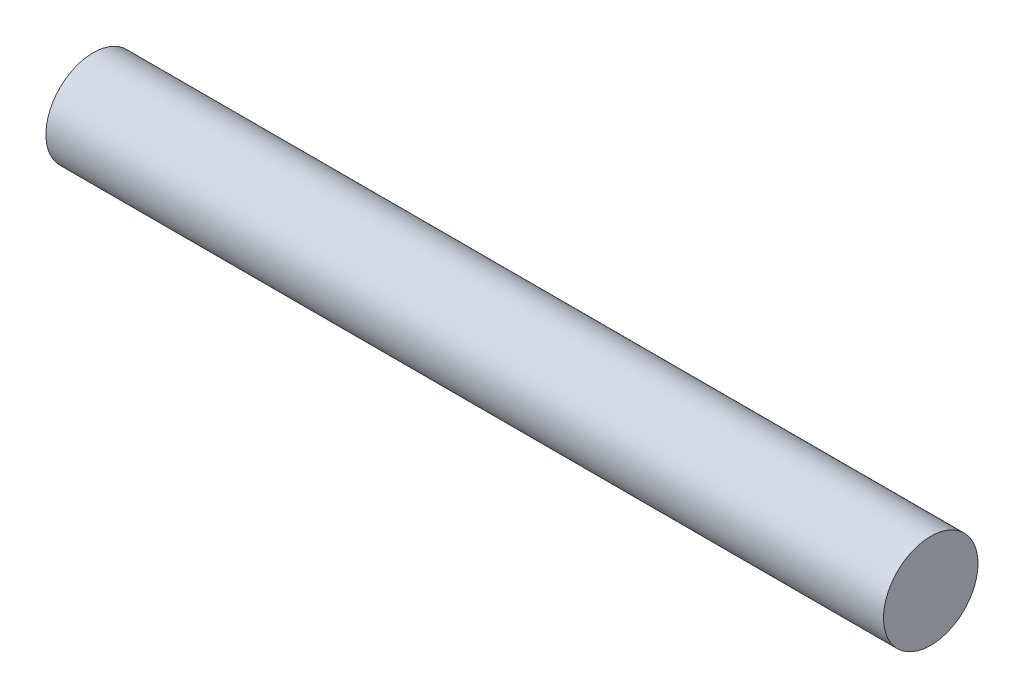
ISO-10303-21;
HEADER;
FILE_DESCRIPTION(('STEP AP214'),'2;1');
FILE_NAME('part.step','',(''),(''),'','','');
FILE_SCHEMA(('AUTOMOTIVE_DESIGN { 1 0 10303 214 1 1 1 1 }'));
ENDSEC;
DATA;
#1=APPLICATION_CONTEXT('core data for automotive mechanical design processes');
#2=APPLICATION_PROTOCOL_DEFINITION('international standard','automotive_design',2000,#1);
#3=PRODUCT_CONTEXT('',#1,'mechanical');
#4=PRODUCT('Part','Part','',(#3));
#5=PRODUCT_RELATED_PRODUCT_CATEGORY('part','',(#4));
#6=PRODUCT_DEFINITION_FORMATION('','',#4);
#7=PRODUCT_DEFINITION_CONTEXT('part definition',#1,'design');
#8=PRODUCT_DEFINITION('design','',#6,#7);
#9=PRODUCT_DEFINITION_SHAPE('','',#8);
#10=(LENGTH_UNIT() NAMED_UNIT(*) SI_UNIT(.MILLI.,.METRE.));
#11=(NAMED_UNIT(*) PLANE_ANGLE_UNIT() SI_UNIT($,.RADIAN.));
#12=(NAMED_UNIT(*) SI_UNIT($,.STERADIAN.) SOLID_ANGLE_UNIT());
#13=UNCERTAINTY_MEASURE_WITH_UNIT(LENGTH_MEASURE(1.E-05),#10,'distance_accuracy_value','');
#14=(GEOMETRIC_REPRESENTATION_CONTEXT(3) GLOBAL_UNCERTAINTY_ASSIGNED_CONTEXT((#13)) GLOBAL_UNIT_ASSIGNED_CONTEXT((#10,
#11,#12)) REPRESENTATION_CONTEXT('',''));
#15=CARTESIAN_POINT('',(0.,0.,0.));
#16=DIRECTION('',(0.,0.,1.));
#17=DIRECTION('',(1.,0.,0.));
#18=AXIS2_PLACEMENT_3D('',#15,#16,#17);
#19=CARTESIAN_POINT('',(88.6,0.,0.));
#20=DIRECTION('',(-1.,0.,0.));
#21=DIRECTION('',(0.,0.,1.));
#22=AXIS2_PLACEMENT_3D('',#19,#20,#21);
#23=CYLINDRICAL_SURFACE('',#22,5.);
#24=CARTESIAN_POINT('',(88.6,0.,0.));
#25=DIRECTION('',(1.,0.,0.));
#26=DIRECTION('',(0.,0.,-1.));
#27=AXIS2_PLACEMENT_3D('',#24,#25,#26);
#28=CIRCLE('',#27,5.);
#29=CARTESIAN_POINT('',(88.6,0.,-5.));
#30=VERTEX_POINT('',#29);
#31=EDGE_CURVE('E10',#30,#30,#28,.T.);
#32=ORIENTED_EDGE('',*,*,#31,.F.);
#33=EDGE_LOOP('',(#32));
#34=FACE_BOUND('',#33,.T.);
#35=CARTESIAN_POINT('',(0.,0.,0.));
#36=DIRECTION('',(1.,0.,0.));
#37=DIRECTION('',(0.,0.,-1.));
#38=AXIS2_PLACEMENT_3D('',#35,#36,#37);
#39=CIRCLE('',#38,5.);
#40=CARTESIAN_POINT('',(0.,0.,-5.));
#41=VERTEX_POINT('',#40);
#42=EDGE_CURVE('E44',#41,#41,#39,.T.);
#43=ORIENTED_EDGE('',*,*,#42,.T.);
#44=EDGE_LOOP('',(#43));
#45=FACE_BOUND('',#44,.T.);
#46=ADVANCED_FACE('F41',(#34,#45),#23,.T.);
#47=CARTESIAN_POINT('',(88.6,0.,0.));
#48=DIRECTION('',(1.,0.,0.));
#49=DIRECTION('',(0.,0.,-1.));
#50=AXIS2_PLACEMENT_3D('',#47,#48,#49);
#51=PLANE('',#50);
#52=ORIENTED_EDGE('',*,*,#31,.T.);
#53=EDGE_LOOP('',(#52));
#54=FACE_BOUND('',#53,.T.);
#55=ADVANCED_FACE('F58',(#54),#51,.T.);
#56=CARTESIAN_POINT('',(0.,0.,0.));
#57=DIRECTION('',(1.,0.,0.));
#58=DIRECTION('',(0.,0.,-1.));
#59=AXIS2_PLACEMENT_3D('',#56,#57,#58);
#60=PLANE('',#59);
#61=ORIENTED_EDGE('',*,*,#42,.F.);
#62=EDGE_LOOP('',(#61));
#63=FACE_BOUND('',#62,.T.);
#64=ADVANCED_FACE('F56',(#63),#60,.F.);
#65=CLOSED_SHELL('',(#46,#55,#64));
#66=MANIFOLD_SOLID_BREP('B2',#65);
#67=ADVANCED_BREP_SHAPE_REPRESENTATION('',(#18,#66),#14);
#68=SHAPE_DEFINITION_REPRESENTATION(#9,#67);
ENDSEC;
END-ISO-10303-21;
